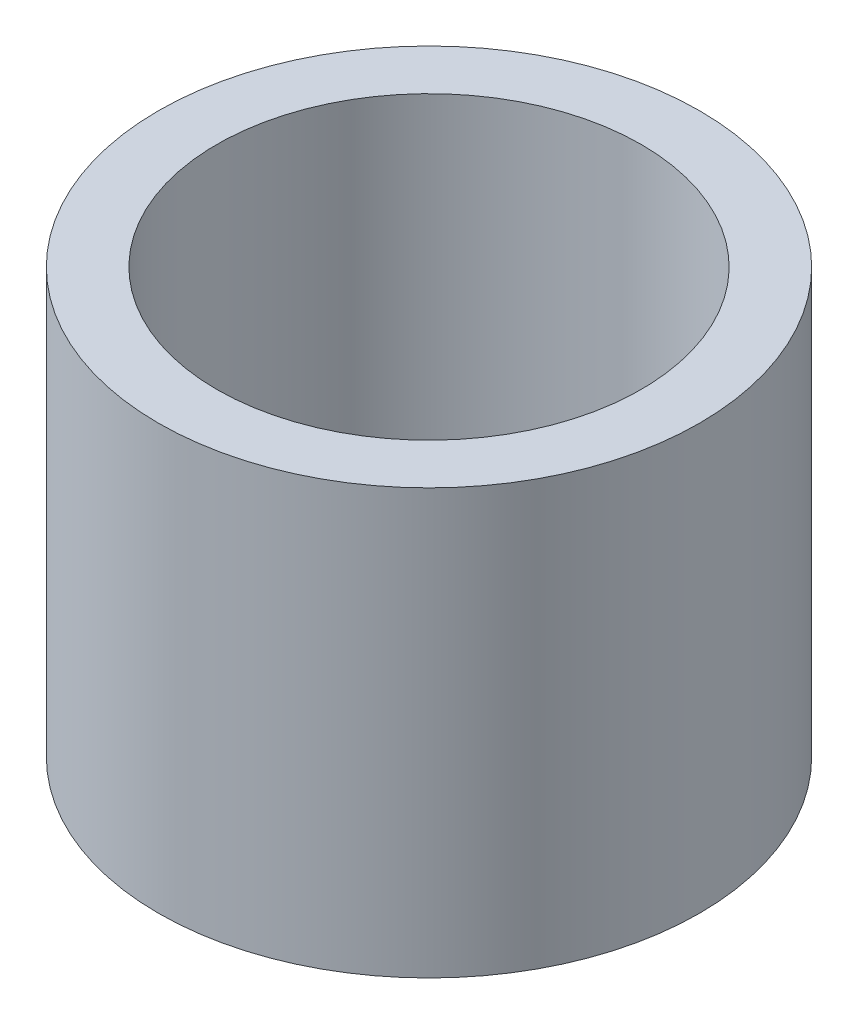
ISO-10303-21;
HEADER;
FILE_DESCRIPTION(('STEP AP214'),'2;1');
FILE_NAME('part.step','',(''),(''),'','','');
FILE_SCHEMA(('AUTOMOTIVE_DESIGN { 1 0 10303 214 1 1 1 1 }'));
ENDSEC;
DATA;
#1=APPLICATION_CONTEXT('core data for automotive mechanical design processes');
#2=APPLICATION_PROTOCOL_DEFINITION('international standard','automotive_design',2000,#1);
#3=PRODUCT_CONTEXT('',#1,'mechanical');
#4=PRODUCT('Part','Part','',(#3));
#5=PRODUCT_RELATED_PRODUCT_CATEGORY('part','',(#4));
#6=PRODUCT_DEFINITION_FORMATION('','',#4);
#7=PRODUCT_DEFINITION_CONTEXT('part definition',#1,'design');
#8=PRODUCT_DEFINITION('design','',#6,#7);
#9=PRODUCT_DEFINITION_SHAPE('','',#8);
#10=(LENGTH_UNIT() NAMED_UNIT(*) SI_UNIT(.MILLI.,.METRE.));
#11=(NAMED_UNIT(*) PLANE_ANGLE_UNIT() SI_UNIT($,.RADIAN.));
#12=(NAMED_UNIT(*) SI_UNIT($,.STERADIAN.) SOLID_ANGLE_UNIT());
#13=UNCERTAINTY_MEASURE_WITH_UNIT(LENGTH_MEASURE(1.E-05),#10,'distance_accuracy_value','');
#14=(GEOMETRIC_REPRESENTATION_CONTEXT(3) GLOBAL_UNCERTAINTY_ASSIGNED_CONTEXT((#13)) GLOBAL_UNIT_ASSIGNED_CONTEXT((#10,
#11,#12)) REPRESENTATION_CONTEXT('',''));
#15=CARTESIAN_POINT('',(0.,0.,0.));
#16=DIRECTION('',(0.,0.,1.));
#17=DIRECTION('',(1.,0.,0.));
#18=AXIS2_PLACEMENT_3D('',#15,#16,#17);
#19=CARTESIAN_POINT('',(0.,4.,0.));
#20=DIRECTION('',(0.,1.,0.));
#21=DIRECTION('',(0.,0.,1.));
#22=AXIS2_PLACEMENT_3D('',#19,#20,#21);
#23=PLANE('',#22);
#24=CARTESIAN_POINT('',(0.,4.,0.));
#25=DIRECTION('',(0.,1.,0.));
#26=DIRECTION('',(0.,0.,1.));
#27=AXIS2_PLACEMENT_3D('',#24,#25,#26);
#28=CIRCLE('',#27,2.55);
#29=CARTESIAN_POINT('',(0.,4.,2.55));
#30=VERTEX_POINT('',#29);
#31=EDGE_CURVE('E10',#30,#30,#28,.T.);
#32=ORIENTED_EDGE('',*,*,#31,.T.);
#33=EDGE_LOOP('',(#32));
#34=FACE_BOUND('',#33,.T.);
#35=CARTESIAN_POINT('',(0.,4.,0.));
#36=DIRECTION('',(0.,1.,0.));
#37=DIRECTION('',(0.,0.,1.));
#38=AXIS2_PLACEMENT_3D('',#35,#36,#37);
#39=CIRCLE('',#38,2.);
#40=CARTESIAN_POINT('',(0.,4.,2.));
#41=VERTEX_POINT('',#40);
#42=EDGE_CURVE('E42',#41,#41,#39,.T.);
#43=ORIENTED_EDGE('',*,*,#42,.F.);
#44=EDGE_LOOP('',(#43));
#45=FACE_BOUND('',#44,.T.);
#46=ADVANCED_FACE('F31',(#34,#45),#23,.T.);
#47=CARTESIAN_POINT('',(0.,0.,0.));
#48=DIRECTION('',(0.,1.,0.));
#49=DIRECTION('',(0.,0.,1.));
#50=AXIS2_PLACEMENT_3D('',#47,#48,#49);
#51=PLANE('',#50);
#52=CARTESIAN_POINT('',(0.,0.,0.));
#53=DIRECTION('',(0.,1.,0.));
#54=DIRECTION('',(0.,0.,1.));
#55=AXIS2_PLACEMENT_3D('',#52,#53,#54);
#56=CIRCLE('',#55,2.55);
#57=CARTESIAN_POINT('',(0.,0.,2.55));
#58=VERTEX_POINT('',#57);
#59=EDGE_CURVE('E35',#58,#58,#56,.T.);
#60=ORIENTED_EDGE('',*,*,#59,.F.);
#61=EDGE_LOOP('',(#60));
#62=FACE_BOUND('',#61,.T.);
#63=CARTESIAN_POINT('',(0.,0.,0.));
#64=DIRECTION('',(0.,1.,0.));
#65=DIRECTION('',(0.,0.,1.));
#66=AXIS2_PLACEMENT_3D('',#63,#64,#65);
#67=CIRCLE('',#66,2.);
#68=CARTESIAN_POINT('',(0.,0.,2.));
#69=VERTEX_POINT('',#68);
#70=EDGE_CURVE('E44',#69,#69,#67,.T.);
#71=ORIENTED_EDGE('',*,*,#70,.T.);
#72=EDGE_LOOP('',(#71));
#73=FACE_BOUND('',#72,.T.);
#74=ADVANCED_FACE('F54',(#62,#73),#51,.F.);
#75=CARTESIAN_POINT('',(0.,4.,0.));
#76=DIRECTION('',(0.,-1.,0.));
#77=DIRECTION('',(0.,0.,-1.));
#78=AXIS2_PLACEMENT_3D('',#75,#76,#77);
#79=CYLINDRICAL_SURFACE('',#78,2.55);
#80=ORIENTED_EDGE('',*,*,#31,.F.);
#81=EDGE_LOOP('',(#80));
#82=FACE_BOUND('',#81,.T.);
#83=ORIENTED_EDGE('',*,*,#59,.T.);
#84=EDGE_LOOP('',(#83));
#85=FACE_BOUND('',#84,.T.);
#86=ADVANCED_FACE('F33',(#82,#85),#79,.T.);
#87=CARTESIAN_POINT('',(0.,4.,0.));
#88=DIRECTION('',(0.,-1.,0.));
#89=DIRECTION('',(0.,0.,-1.));
#90=AXIS2_PLACEMENT_3D('',#87,#88,#89);
#91=CYLINDRICAL_SURFACE('',#90,2.);
#92=ORIENTED_EDGE('',*,*,#42,.T.);
#93=EDGE_LOOP('',(#92));
#94=FACE_BOUND('',#93,.T.);
#95=ORIENTED_EDGE('',*,*,#70,.F.);
#96=EDGE_LOOP('',(#95));
#97=FACE_BOUND('',#96,.T.);
#98=ADVANCED_FACE('F50',(#94,#97),#91,.F.);
#99=CLOSED_SHELL('',(#46,#74,#86,#98));
#100=MANIFOLD_SOLID_BREP('B2',#99);
#101=ADVANCED_BREP_SHAPE_REPRESENTATION('',(#18,#100),#14);
#102=SHAPE_DEFINITION_REPRESENTATION(#9,#101);
ENDSEC;
END-ISO-10303-21;
